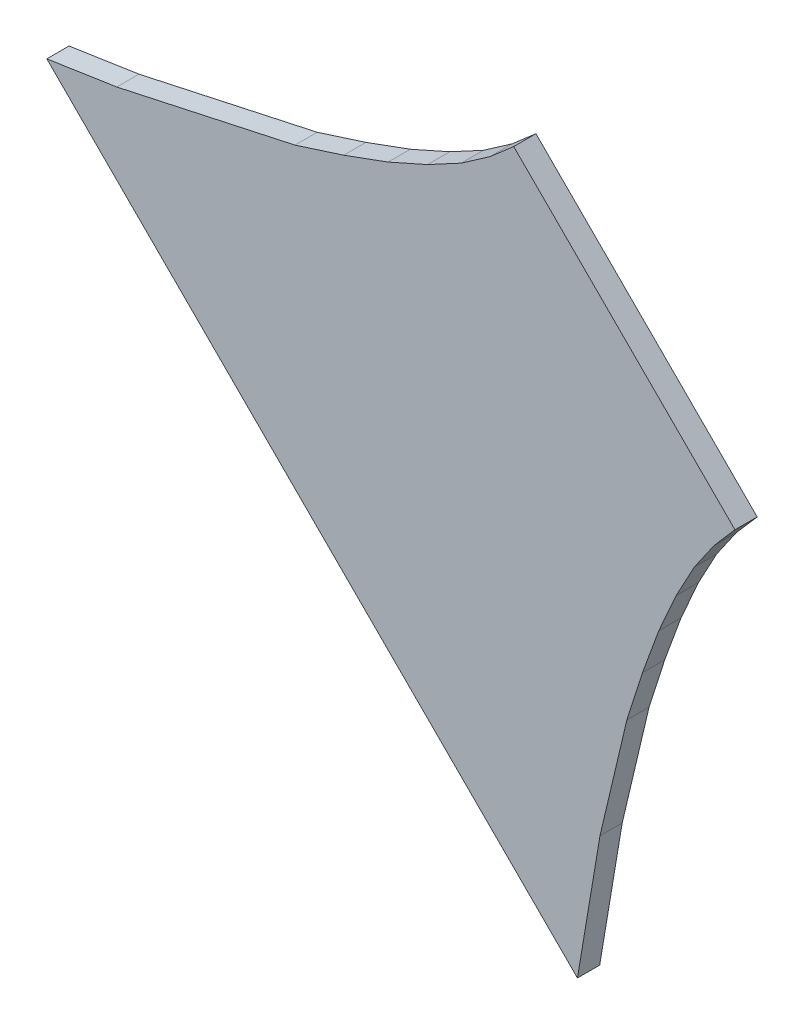
ISO-10303-21;
HEADER;
FILE_DESCRIPTION(('STEP AP214'),'2;1');
FILE_NAME('part.step','',(''),(''),'','','');
FILE_SCHEMA(('AUTOMOTIVE_DESIGN { 1 0 10303 214 1 1 1 1 }'));
ENDSEC;
DATA;
#1=APPLICATION_CONTEXT('core data for automotive mechanical design processes');
#2=APPLICATION_PROTOCOL_DEFINITION('international standard','automotive_design',2000,#1);
#3=PRODUCT_CONTEXT('',#1,'mechanical');
#4=PRODUCT('Part','Part','',(#3));
#5=PRODUCT_RELATED_PRODUCT_CATEGORY('part','',(#4));
#6=PRODUCT_DEFINITION_FORMATION('','',#4);
#7=PRODUCT_DEFINITION_CONTEXT('part definition',#1,'design');
#8=PRODUCT_DEFINITION('design','',#6,#7);
#9=PRODUCT_DEFINITION_SHAPE('','',#8);
#10=(LENGTH_UNIT() NAMED_UNIT(*) SI_UNIT(.MILLI.,.METRE.));
#11=(NAMED_UNIT(*) PLANE_ANGLE_UNIT() SI_UNIT($,.RADIAN.));
#12=(NAMED_UNIT(*) SI_UNIT($,.STERADIAN.) SOLID_ANGLE_UNIT());
#13=UNCERTAINTY_MEASURE_WITH_UNIT(LENGTH_MEASURE(1.E-05),#10,'distance_accuracy_value','');
#14=(GEOMETRIC_REPRESENTATION_CONTEXT(3) GLOBAL_UNCERTAINTY_ASSIGNED_CONTEXT((#13)) GLOBAL_UNIT_ASSIGNED_CONTEXT((#10,
#11,#12)) REPRESENTATION_CONTEXT('',''));
#15=CARTESIAN_POINT('',(0.,0.,0.));
#16=DIRECTION('',(0.,0.,1.));
#17=DIRECTION('',(1.,0.,0.));
#18=AXIS2_PLACEMENT_3D('',#15,#16,#17);
#19=CARTESIAN_POINT('',(91.931999206543,105.322998046875,0.));
#20=DIRECTION('',(0.655634347834404,-0.755078540245818,0.));
#21=DIRECTION('',(-0.755078540245818,-0.655634347834404,0.));
#22=AXIS2_PLACEMENT_3D('',#19,#20,#21);
#23=PLANE('',#22);
#24=DIRECTION('',(-0.755078540245818,-0.655634347834404,0.));
#25=VECTOR('',#24,1.);
#26=CARTESIAN_POINT('',(91.931999206543,105.322998046875,0.03556));
#27=LINE('',#26,#25);
#28=CARTESIAN_POINT('',(91.931999206543,105.322998046875,0.03556));
#29=VERTEX_POINT('',#28);
#30=CARTESIAN_POINT('',(91.8939971923828,105.290000915527,0.03556));
#31=VERTEX_POINT('',#30);
#32=EDGE_CURVE('E11',#29,#31,#27,.T.);
#33=ORIENTED_EDGE('',*,*,#32,.F.);
#34=DIRECTION('',(0.,0.,1.));
#35=VECTOR('',#34,1.);
#36=CARTESIAN_POINT('',(91.931999206543,105.322998046875,0.));
#37=LINE('',#36,#35);
#38=CARTESIAN_POINT('',(91.931999206543,105.322998046875,0.));
#39=VERTEX_POINT('',#38);
#40=EDGE_CURVE('E24',#39,#29,#37,.T.);
#41=ORIENTED_EDGE('',*,*,#40,.F.);
#42=DIRECTION('',(-0.755078540245818,-0.655634347834404,0.));
#43=VECTOR('',#42,1.);
#44=CARTESIAN_POINT('',(91.931999206543,105.322998046875,0.));
#45=LINE('',#44,#43);
#46=CARTESIAN_POINT('',(91.8939971923828,105.290000915527,0.));
#47=VERTEX_POINT('',#46);
#48=EDGE_CURVE('E160',#39,#47,#45,.T.);
#49=ORIENTED_EDGE('',*,*,#48,.T.);
#50=DIRECTION('',(0.,0.,1.));
#51=VECTOR('',#50,1.);
#52=CARTESIAN_POINT('',(91.8939971923828,105.290000915527,0.));
#53=LINE('',#52,#51);
#54=EDGE_CURVE('E37',#47,#31,#53,.T.);
#55=ORIENTED_EDGE('',*,*,#54,.T.);
#56=EDGE_LOOP('',(#33,#41,#49,#55));
#57=FACE_BOUND('',#56,.T.);
#58=ADVANCED_FACE('F17',(#57),#23,.F.);
#59=CARTESIAN_POINT('',(91.8939971923828,105.290000915527,0.));
#60=DIRECTION('',(0.571056509348548,-0.820910752232331,0.));
#61=DIRECTION('',(-0.820910752232331,-0.571056509348548,0.));
#62=AXIS2_PLACEMENT_3D('',#59,#60,#61);
#63=PLANE('',#62);
#64=DIRECTION('',(-0.820910752232331,-0.571056509348548,0.));
#65=VECTOR('',#64,1.);
#66=CARTESIAN_POINT('',(91.8939971923828,105.290000915527,0.03556));
#67=LINE('',#66,#65);
#68=CARTESIAN_POINT('',(91.8479995727539,105.258003234863,0.03556));
#69=VERTEX_POINT('',#68);
#70=EDGE_CURVE('E280',#31,#69,#67,.T.);
#71=ORIENTED_EDGE('',*,*,#70,.F.);
#72=ORIENTED_EDGE('',*,*,#54,.F.);
#73=DIRECTION('',(-0.820910752232331,-0.571056509348548,0.));
#74=VECTOR('',#73,1.);
#75=CARTESIAN_POINT('',(91.8939971923828,105.290000915527,0.));
#76=LINE('',#75,#74);
#77=CARTESIAN_POINT('',(91.8479995727539,105.258003234863,0.));
#78=VERTEX_POINT('',#77);
#79=EDGE_CURVE('E277',#47,#78,#76,.T.);
#80=ORIENTED_EDGE('',*,*,#79,.T.);
#81=DIRECTION('',(0.,0.,1.));
#82=VECTOR('',#81,1.);
#83=CARTESIAN_POINT('',(91.8479995727539,105.258003234863,0.));
#84=LINE('',#83,#82);
#85=EDGE_CURVE('E275',#78,#69,#84,.T.);
#86=ORIENTED_EDGE('',*,*,#85,.T.);
#87=EDGE_LOOP('',(#71,#72,#80,#86));
#88=FACE_BOUND('',#87,.T.);
#89=ADVANCED_FACE('F288',(#88),#63,.F.);
#90=CARTESIAN_POINT('',(91.8479995727539,105.258003234863,0.));
#91=DIRECTION('',(0.473208926679227,-0.880950232255542,0.));
#92=DIRECTION('',(-0.880950232255542,-0.473208926679227,0.));
#93=AXIS2_PLACEMENT_3D('',#90,#91,#92);
#94=PLANE('',#93);
#95=DIRECTION('',(-0.880950232255542,-0.473208926679227,0.));
#96=VECTOR('',#95,1.);
#97=CARTESIAN_POINT('',(91.8479995727539,105.258003234863,0.03556));
#98=LINE('',#97,#96);
#99=CARTESIAN_POINT('',(91.7939987182617,105.228996276855,0.03556));
#100=VERTEX_POINT('',#99);
#101=EDGE_CURVE('E272',#69,#100,#98,.T.);
#102=ORIENTED_EDGE('',*,*,#101,.F.);
#103=ORIENTED_EDGE('',*,*,#85,.F.);
#104=DIRECTION('',(-0.880950232255542,-0.473208926679227,0.));
#105=VECTOR('',#104,1.);
#106=CARTESIAN_POINT('',(91.8479995727539,105.258003234863,0.));
#107=LINE('',#106,#105);
#108=CARTESIAN_POINT('',(91.7939987182617,105.228996276855,0.));
#109=VERTEX_POINT('',#108);
#110=EDGE_CURVE('E269',#78,#109,#107,.T.);
#111=ORIENTED_EDGE('',*,*,#110,.T.);
#112=DIRECTION('',(0.,0.,1.));
#113=VECTOR('',#112,1.);
#114=CARTESIAN_POINT('',(91.7939987182617,105.228996276855,0.));
#115=LINE('',#114,#113);
#116=EDGE_CURVE('E267',#109,#100,#115,.T.);
#117=ORIENTED_EDGE('',*,*,#116,.T.);
#118=EDGE_LOOP('',(#102,#103,#111,#117));
#119=FACE_BOUND('',#118,.T.);
#120=ADVANCED_FACE('F294',(#119),#94,.F.);
#121=CARTESIAN_POINT('',(91.7939987182617,105.228996276855,0.));
#122=DIRECTION('',(0.406159002657106,-0.913802420964502,0.));
#123=DIRECTION('',(-0.913802420964502,-0.406159002657106,0.));
#124=AXIS2_PLACEMENT_3D('',#121,#122,#123);
#125=PLANE('',#124);
#126=DIRECTION('',(-0.913802420964502,-0.406159002657106,0.));
#127=VECTOR('',#126,1.);
#128=CARTESIAN_POINT('',(91.7939987182617,105.228996276855,0.03556));
#129=LINE('',#128,#127);
#130=CARTESIAN_POINT('',(91.7310028076172,105.200996398926,0.03556));
#131=VERTEX_POINT('',#130);
#132=EDGE_CURVE('E264',#100,#131,#129,.T.);
#133=ORIENTED_EDGE('',*,*,#132,.F.);
#134=ORIENTED_EDGE('',*,*,#116,.F.);
#135=DIRECTION('',(-0.913802420964502,-0.406159002657106,0.));
#136=VECTOR('',#135,1.);
#137=CARTESIAN_POINT('',(91.7939987182617,105.228996276855,0.));
#138=LINE('',#137,#136);
#139=CARTESIAN_POINT('',(91.7310028076172,105.200996398926,0.));
#140=VERTEX_POINT('',#139);
#141=EDGE_CURVE('E261',#109,#140,#138,.T.);
#142=ORIENTED_EDGE('',*,*,#141,.T.);
#143=DIRECTION('',(0.,0.,1.));
#144=VECTOR('',#143,1.);
#145=CARTESIAN_POINT('',(91.7310028076172,105.200996398926,0.));
#146=LINE('',#145,#144);
#147=EDGE_CURVE('E259',#140,#131,#146,.T.);
#148=ORIENTED_EDGE('',*,*,#147,.T.);
#149=EDGE_LOOP('',(#133,#134,#142,#148));
#150=FACE_BOUND('',#149,.T.);
#151=ADVANCED_FACE('F296',(#150),#125,.F.);
#152=CARTESIAN_POINT('',(91.7310028076172,105.200996398926,0.));
#153=DIRECTION('',(0.343792073197741,-0.939045797821597,0.));
#154=DIRECTION('',(-0.939045797821597,-0.343792073197741,0.));
#155=AXIS2_PLACEMENT_3D('',#152,#153,#154);
#156=PLANE('',#155);
#157=DIRECTION('',(-0.939045797821597,-0.343792073197741,0.));
#158=VECTOR('',#157,1.);
#159=CARTESIAN_POINT('',(91.7310028076172,105.200996398926,0.03556));
#160=LINE('',#159,#158);
#161=CARTESIAN_POINT('',(91.6600036621094,105.175003051758,0.03556));
#162=VERTEX_POINT('',#161);
#163=EDGE_CURVE('E256',#131,#162,#160,.T.);
#164=ORIENTED_EDGE('',*,*,#163,.F.);
#165=ORIENTED_EDGE('',*,*,#147,.F.);
#166=DIRECTION('',(-0.939045797821597,-0.343792073197741,0.));
#167=VECTOR('',#166,1.);
#168=CARTESIAN_POINT('',(91.7310028076172,105.200996398926,0.));
#169=LINE('',#168,#167);
#170=CARTESIAN_POINT('',(91.6600036621094,105.175003051758,0.));
#171=VERTEX_POINT('',#170);
#172=EDGE_CURVE('E253',#140,#171,#169,.T.);
#173=ORIENTED_EDGE('',*,*,#172,.T.);
#174=DIRECTION('',(0.,0.,1.));
#175=VECTOR('',#174,1.);
#176=CARTESIAN_POINT('',(91.6600036621094,105.175003051758,0.));
#177=LINE('',#176,#175);
#178=EDGE_CURVE('E251',#171,#162,#177,.T.);
#179=ORIENTED_EDGE('',*,*,#178,.T.);
#180=EDGE_LOOP('',(#164,#165,#173,#179));
#181=FACE_BOUND('',#180,.T.);
#182=ADVANCED_FACE('F301',(#181),#156,.F.);
#183=CARTESIAN_POINT('',(91.6600036621094,105.175003051758,0.));
#184=DIRECTION('',(0.305225179343562,-0.952280205556479,0.));
#185=DIRECTION('',(-0.952280205556479,-0.305225179343562,0.));
#186=AXIS2_PLACEMENT_3D('',#183,#184,#185);
#187=PLANE('',#186);
#188=DIRECTION('',(-0.952280205556479,-0.305225179343562,0.));
#189=VECTOR('',#188,1.);
#190=CARTESIAN_POINT('',(91.6600036621094,105.175003051758,0.03556));
#191=LINE('',#190,#189);
#192=CARTESIAN_POINT('',(91.5820007324219,105.150001525879,0.03556));
#193=VERTEX_POINT('',#192);
#194=EDGE_CURVE('E248',#162,#193,#191,.T.);
#195=ORIENTED_EDGE('',*,*,#194,.F.);
#196=ORIENTED_EDGE('',*,*,#178,.F.);
#197=DIRECTION('',(-0.952280205556479,-0.305225179343562,0.));
#198=VECTOR('',#197,1.);
#199=CARTESIAN_POINT('',(91.6600036621094,105.175003051758,0.));
#200=LINE('',#199,#198);
#201=CARTESIAN_POINT('',(91.5820007324219,105.150001525879,0.));
#202=VERTEX_POINT('',#201);
#203=EDGE_CURVE('E245',#171,#202,#200,.T.);
#204=ORIENTED_EDGE('',*,*,#203,.T.);
#205=DIRECTION('',(0.,0.,1.));
#206=VECTOR('',#205,1.);
#207=CARTESIAN_POINT('',(91.5820007324219,105.150001525879,0.));
#208=LINE('',#207,#206);
#209=EDGE_CURVE('E243',#202,#193,#208,.T.);
#210=ORIENTED_EDGE('',*,*,#209,.T.);
#211=EDGE_LOOP('',(#195,#196,#204,#210));
#212=FACE_BOUND('',#211,.T.);
#213=ADVANCED_FACE('F304',(#212),#187,.F.);
#214=CARTESIAN_POINT('',(91.5820007324219,105.150001525879,0.));
#215=DIRECTION('',(0.212582762798648,-0.977143064735607,0.));
#216=DIRECTION('',(-0.977143064735607,-0.212582762798648,0.));
#217=AXIS2_PLACEMENT_3D('',#214,#215,#216);
#218=PLANE('',#217);
#219=DIRECTION('',(-0.977143064735607,-0.212582762798648,0.));
#220=VECTOR('',#219,1.);
#221=CARTESIAN_POINT('',(91.5820007324219,105.150001525879,0.03556));
#222=LINE('',#221,#220);
#223=CARTESIAN_POINT('',(91.2969970703125,105.087997436523,0.03556));
#224=VERTEX_POINT('',#223);
#225=EDGE_CURVE('E240',#193,#224,#222,.T.);
#226=ORIENTED_EDGE('',*,*,#225,.F.);
#227=ORIENTED_EDGE('',*,*,#209,.F.);
#228=DIRECTION('',(-0.977143064735607,-0.212582762798648,0.));
#229=VECTOR('',#228,1.);
#230=CARTESIAN_POINT('',(91.5820007324219,105.150001525879,0.));
#231=LINE('',#230,#229);
#232=CARTESIAN_POINT('',(91.2969970703125,105.087997436523,0.));
#233=VERTEX_POINT('',#232);
#234=EDGE_CURVE('E237',#202,#233,#231,.T.);
#235=ORIENTED_EDGE('',*,*,#234,.T.);
#236=DIRECTION('',(0.,0.,1.));
#237=VECTOR('',#236,1.);
#238=CARTESIAN_POINT('',(91.2969970703125,105.087997436523,0.));
#239=LINE('',#238,#237);
#240=EDGE_CURVE('E235',#233,#224,#239,.T.);
#241=ORIENTED_EDGE('',*,*,#240,.T.);
#242=EDGE_LOOP('',(#226,#227,#235,#241));
#243=FACE_BOUND('',#242,.T.);
#244=ADVANCED_FACE('F309',(#243),#218,.F.);
#245=CARTESIAN_POINT('',(91.2969970703125,105.087997436523,0.));
#246=DIRECTION('',(0.150052763089028,-0.988677990191624,0.));
#247=DIRECTION('',(-0.988677990191624,-0.150052763089028,0.));
#248=AXIS2_PLACEMENT_3D('',#245,#246,#247);
#249=PLANE('',#248);
#250=DIRECTION('',(-0.988677990191624,-0.150052763089028,0.));
#251=VECTOR('',#250,1.);
#252=CARTESIAN_POINT('',(91.2969970703125,105.087997436523,0.03556));
#253=LINE('',#252,#251);
#254=CARTESIAN_POINT('',(91.1849975585938,105.070999145508,0.03556));
#255=VERTEX_POINT('',#254);
#256=EDGE_CURVE('E232',#224,#255,#253,.T.);
#257=ORIENTED_EDGE('',*,*,#256,.F.);
#258=ORIENTED_EDGE('',*,*,#240,.F.);
#259=DIRECTION('',(-0.988677990191624,-0.150052763089028,0.));
#260=VECTOR('',#259,1.);
#261=CARTESIAN_POINT('',(91.2969970703125,105.087997436523,0.));
#262=LINE('',#261,#260);
#263=CARTESIAN_POINT('',(91.1849975585938,105.070999145508,0.));
#264=VERTEX_POINT('',#263);
#265=EDGE_CURVE('E229',#233,#264,#262,.T.);
#266=ORIENTED_EDGE('',*,*,#265,.T.);
#267=DIRECTION('',(0.,0.,1.));
#268=VECTOR('',#267,1.);
#269=CARTESIAN_POINT('',(91.1849975585938,105.070999145508,0.));
#270=LINE('',#269,#268);
#271=EDGE_CURVE('E227',#264,#255,#270,.T.);
#272=ORIENTED_EDGE('',*,*,#271,.T.);
#273=EDGE_LOOP('',(#257,#258,#266,#272));
#274=FACE_BOUND('',#273,.T.);
#275=ADVANCED_FACE('F312',(#274),#249,.F.);
#276=CARTESIAN_POINT('',(91.1849975585938,105.070999145508,0.));
#277=DIRECTION('',(0.707106781186548,0.707106781186548,0.));
#278=DIRECTION('',(0.707106781186548,-0.707106781186548,0.));
#279=AXIS2_PLACEMENT_3D('',#276,#277,#278);
#280=PLANE('',#279);
#281=DIRECTION('',(0.707106781186548,-0.707106781186548,0.));
#282=VECTOR('',#281,1.);
#283=CARTESIAN_POINT('',(91.1849975585938,105.070999145508,0.03556));
#284=LINE('',#283,#282);
#285=CARTESIAN_POINT('',(92.0339965820313,104.22200012207,0.03556));
#286=VERTEX_POINT('',#285);
#287=EDGE_CURVE('E224',#255,#286,#284,.T.);
#288=ORIENTED_EDGE('',*,*,#287,.F.);
#289=ORIENTED_EDGE('',*,*,#271,.F.);
#290=DIRECTION('',(0.707106781186548,-0.707106781186548,0.));
#291=VECTOR('',#290,1.);
#292=CARTESIAN_POINT('',(91.1849975585938,105.070999145508,0.));
#293=LINE('',#292,#291);
#294=CARTESIAN_POINT('',(92.0339965820313,104.22200012207,0.));
#295=VERTEX_POINT('',#294);
#296=EDGE_CURVE('E221',#264,#295,#293,.T.);
#297=ORIENTED_EDGE('',*,*,#296,.T.);
#298=DIRECTION('',(0.,0.,1.));
#299=VECTOR('',#298,1.);
#300=CARTESIAN_POINT('',(92.0339965820313,104.22200012207,0.));
#301=LINE('',#300,#299);
#302=EDGE_CURVE('E219',#295,#286,#301,.T.);
#303=ORIENTED_EDGE('',*,*,#302,.T.);
#304=EDGE_LOOP('',(#288,#289,#297,#303));
#305=FACE_BOUND('',#304,.T.);
#306=ADVANCED_FACE('F317',(#305),#280,.F.);
#307=CARTESIAN_POINT('',(92.0339965820313,104.22200012207,0.));
#308=DIRECTION('',(-0.986266878151509,0.16515945344205,0.));
#309=DIRECTION('',(0.16515945344205,0.986266878151509,0.));
#310=AXIS2_PLACEMENT_3D('',#307,#308,#309);
#311=PLANE('',#310);
#312=DIRECTION('',(0.16515945344205,0.986266878151509,0.));
#313=VECTOR('',#312,1.);
#314=CARTESIAN_POINT('',(92.0339965820313,104.22200012207,0.03556));
#315=LINE('',#314,#313);
#316=CARTESIAN_POINT('',(92.0699996948242,104.436996459961,0.03556));
#317=VERTEX_POINT('',#316);
#318=EDGE_CURVE('E216',#286,#317,#315,.T.);
#319=ORIENTED_EDGE('',*,*,#318,.F.);
#320=ORIENTED_EDGE('',*,*,#302,.F.);
#321=DIRECTION('',(0.16515945344205,0.986266878151509,0.));
#322=VECTOR('',#321,1.);
#323=CARTESIAN_POINT('',(92.0339965820313,104.22200012207,0.));
#324=LINE('',#323,#322);
#325=CARTESIAN_POINT('',(92.0699996948242,104.436996459961,0.));
#326=VERTEX_POINT('',#325);
#327=EDGE_CURVE('E213',#295,#326,#324,.T.);
#328=ORIENTED_EDGE('',*,*,#327,.T.);
#329=DIRECTION('',(0.,0.,1.));
#330=VECTOR('',#329,1.);
#331=CARTESIAN_POINT('',(92.0699996948242,104.436996459961,0.));
#332=LINE('',#331,#330);
#333=EDGE_CURVE('E211',#326,#317,#332,.T.);
#334=ORIENTED_EDGE('',*,*,#333,.T.);
#335=EDGE_LOOP('',(#319,#320,#328,#334));
#336=FACE_BOUND('',#335,.T.);
#337=ADVANCED_FACE('F320',(#336),#311,.F.);
#338=CARTESIAN_POINT('',(92.0699996948242,104.436996459961,0.));
#339=DIRECTION('',(-0.973209181385441,0.22992148500538,0.));
#340=DIRECTION('',(0.22992148500538,0.973209181385441,0.));
#341=AXIS2_PLACEMENT_3D('',#338,#339,#340);
#342=PLANE('',#341);
#343=DIRECTION('',(0.22992148500538,0.973209181385441,0.));
#344=VECTOR('',#343,1.);
#345=CARTESIAN_POINT('',(92.0699996948242,104.436996459961,0.03556));
#346=LINE('',#345,#344);
#347=CARTESIAN_POINT('',(92.1129989624023,104.619003295898,0.03556));
#348=VERTEX_POINT('',#347);
#349=EDGE_CURVE('E208',#317,#348,#346,.T.);
#350=ORIENTED_EDGE('',*,*,#349,.F.);
#351=ORIENTED_EDGE('',*,*,#333,.F.);
#352=DIRECTION('',(0.22992148500538,0.973209181385441,0.));
#353=VECTOR('',#352,1.);
#354=CARTESIAN_POINT('',(92.0699996948242,104.436996459961,0.));
#355=LINE('',#354,#353);
#356=CARTESIAN_POINT('',(92.1129989624023,104.619003295898,0.));
#357=VERTEX_POINT('',#356);
#358=EDGE_CURVE('E205',#326,#357,#355,.T.);
#359=ORIENTED_EDGE('',*,*,#358,.T.);
#360=DIRECTION('',(0.,0.,1.));
#361=VECTOR('',#360,1.);
#362=CARTESIAN_POINT('',(92.1129989624023,104.619003295898,0.));
#363=LINE('',#362,#361);
#364=EDGE_CURVE('E203',#357,#348,#363,.T.);
#365=ORIENTED_EDGE('',*,*,#364,.T.);
#366=EDGE_LOOP('',(#350,#351,#359,#365));
#367=FACE_BOUND('',#366,.T.);
#368=ADVANCED_FACE('F325',(#367),#342,.F.);
#369=CARTESIAN_POINT('',(92.1129989624023,104.619003295898,0.));
#370=DIRECTION('',(-0.952271527101495,0.305252254163318,0.));
#371=DIRECTION('',(0.305252254163318,0.952271527101495,0.));
#372=AXIS2_PLACEMENT_3D('',#369,#370,#371);
#373=PLANE('',#372);
#374=DIRECTION('',(0.305252254163318,0.952271527101495,0.));
#375=VECTOR('',#374,1.);
#376=CARTESIAN_POINT('',(92.1129989624023,104.619003295898,0.03556));
#377=LINE('',#376,#375);
#378=CARTESIAN_POINT('',(92.1380004882812,104.696998596191,0.03556));
#379=VERTEX_POINT('',#378);
#380=EDGE_CURVE('E200',#348,#379,#377,.T.);
#381=ORIENTED_EDGE('',*,*,#380,.F.);
#382=ORIENTED_EDGE('',*,*,#364,.F.);
#383=DIRECTION('',(0.305252254163318,0.952271527101495,0.));
#384=VECTOR('',#383,1.);
#385=CARTESIAN_POINT('',(92.1129989624023,104.619003295898,0.));
#386=LINE('',#385,#384);
#387=CARTESIAN_POINT('',(92.1380004882812,104.696998596191,0.));
#388=VERTEX_POINT('',#387);
#389=EDGE_CURVE('E197',#357,#388,#386,.T.);
#390=ORIENTED_EDGE('',*,*,#389,.T.);
#391=DIRECTION('',(0.,0.,1.));
#392=VECTOR('',#391,1.);
#393=CARTESIAN_POINT('',(92.1380004882812,104.696998596191,0.));
#394=LINE('',#393,#392);
#395=EDGE_CURVE('E195',#388,#379,#394,.T.);
#396=ORIENTED_EDGE('',*,*,#395,.T.);
#397=EDGE_LOOP('',(#381,#382,#390,#396));
#398=FACE_BOUND('',#397,.T.);
#399=ADVANCED_FACE('F328',(#398),#373,.F.);
#400=CARTESIAN_POINT('',(92.1380004882812,104.696998596191,0.));
#401=DIRECTION('',(-0.939013218091138,0.343881049565291,0.));
#402=DIRECTION('',(0.343881049565291,0.939013218091138,0.));
#403=AXIS2_PLACEMENT_3D('',#400,#401,#402);
#404=PLANE('',#403);
#405=DIRECTION('',(0.343881049565291,0.939013218091137,0.));
#406=VECTOR('',#405,1.);
#407=CARTESIAN_POINT('',(92.1380004882812,104.696998596191,0.03556));
#408=LINE('',#407,#406);
#409=CARTESIAN_POINT('',(92.1640014648438,104.767997741699,0.03556));
#410=VERTEX_POINT('',#409);
#411=EDGE_CURVE('E192',#379,#410,#408,.T.);
#412=ORIENTED_EDGE('',*,*,#411,.F.);
#413=ORIENTED_EDGE('',*,*,#395,.F.);
#414=DIRECTION('',(0.343881049565291,0.939013218091137,0.));
#415=VECTOR('',#414,1.);
#416=CARTESIAN_POINT('',(92.1380004882812,104.696998596191,0.));
#417=LINE('',#416,#415);
#418=CARTESIAN_POINT('',(92.1640014648438,104.767997741699,0.));
#419=VERTEX_POINT('',#418);
#420=EDGE_CURVE('E189',#388,#419,#417,.T.);
#421=ORIENTED_EDGE('',*,*,#420,.T.);
#422=DIRECTION('',(0.,0.,1.));
#423=VECTOR('',#422,1.);
#424=CARTESIAN_POINT('',(92.1640014648438,104.767997741699,0.));
#425=LINE('',#424,#423);
#426=EDGE_CURVE('E187',#419,#410,#425,.T.);
#427=ORIENTED_EDGE('',*,*,#426,.T.);
#428=EDGE_LOOP('',(#412,#413,#421,#427));
#429=FACE_BOUND('',#428,.T.);
#430=ADVANCED_FACE('F333',(#429),#404,.F.);
#431=CARTESIAN_POINT('',(92.1640014648438,104.767997741699,0.));
#432=DIRECTION('',(-0.913820674891546,0.406117931321382,0.));
#433=DIRECTION('',(0.406117931321382,0.913820674891546,0.));
#434=AXIS2_PLACEMENT_3D('',#431,#432,#433);
#435=PLANE('',#434);
#436=DIRECTION('',(0.406117931321382,0.913820674891546,0.));
#437=VECTOR('',#436,1.);
#438=CARTESIAN_POINT('',(92.1640014648438,104.767997741699,0.03556));
#439=LINE('',#438,#437);
#440=CARTESIAN_POINT('',(92.1920013427734,104.831001281738,0.03556));
#441=VERTEX_POINT('',#440);
#442=EDGE_CURVE('E184',#410,#441,#439,.T.);
#443=ORIENTED_EDGE('',*,*,#442,.F.);
#444=ORIENTED_EDGE('',*,*,#426,.F.);
#445=DIRECTION('',(0.406117931321382,0.913820674891546,0.));
#446=VECTOR('',#445,1.);
#447=CARTESIAN_POINT('',(92.1640014648438,104.767997741699,0.));
#448=LINE('',#447,#446);
#449=CARTESIAN_POINT('',(92.1920013427734,104.831001281738,0.));
#450=VERTEX_POINT('',#449);
#451=EDGE_CURVE('E181',#419,#450,#448,.T.);
#452=ORIENTED_EDGE('',*,*,#451,.T.);
#453=DIRECTION('',(0.,0.,1.));
#454=VECTOR('',#453,1.);
#455=CARTESIAN_POINT('',(92.1920013427734,104.831001281738,0.));
#456=LINE('',#455,#454);
#457=EDGE_CURVE('E179',#450,#441,#456,.T.);
#458=ORIENTED_EDGE('',*,*,#457,.T.);
#459=EDGE_LOOP('',(#443,#444,#452,#458));
#460=FACE_BOUND('',#459,.T.);
#461=ADVANCED_FACE('F336',(#460),#435,.F.);
#462=CARTESIAN_POINT('',(92.1920013427734,104.831001281738,0.));
#463=DIRECTION('',(-0.881002115409217,0.473112325610403,0.));
#464=DIRECTION('',(0.473112325610403,0.881002115409217,0.));
#465=AXIS2_PLACEMENT_3D('',#462,#463,#464);
#466=PLANE('',#465);
#467=DIRECTION('',(0.473112325610403,0.881002115409217,0.));
#468=VECTOR('',#467,1.);
#469=CARTESIAN_POINT('',(92.1920013427734,104.831001281738,0.03556));
#470=LINE('',#469,#468);
#471=CARTESIAN_POINT('',(92.2210006713867,104.88500213623,0.03556));
#472=VERTEX_POINT('',#471);
#473=EDGE_CURVE('E176',#441,#472,#470,.T.);
#474=ORIENTED_EDGE('',*,*,#473,.F.);
#475=ORIENTED_EDGE('',*,*,#457,.F.);
#476=DIRECTION('',(0.473112325610403,0.881002115409217,0.));
#477=VECTOR('',#476,1.);
#478=CARTESIAN_POINT('',(92.1920013427734,104.831001281738,0.));
#479=LINE('',#478,#477);
#480=CARTESIAN_POINT('',(92.2210006713867,104.88500213623,0.));
#481=VERTEX_POINT('',#480);
#482=EDGE_CURVE('E173',#450,#481,#479,.T.);
#483=ORIENTED_EDGE('',*,*,#482,.T.);
#484=DIRECTION('',(0.,0.,1.));
#485=VECTOR('',#484,1.);
#486=CARTESIAN_POINT('',(92.2210006713867,104.88500213623,0.));
#487=LINE('',#486,#485);
#488=EDGE_CURVE('E171',#481,#472,#487,.T.);
#489=ORIENTED_EDGE('',*,*,#488,.T.);
#490=EDGE_LOOP('',(#474,#475,#483,#489));
#491=FACE_BOUND('',#490,.T.);
#492=ADVANCED_FACE('F341',(#491),#466,.F.);
#493=CARTESIAN_POINT('',(92.2210006713867,104.88500213623,0.));
#494=DIRECTION('',(-0.820910752232331,0.571056509348548,0.));
#495=DIRECTION('',(0.571056509348548,0.820910752232331,0.));
#496=AXIS2_PLACEMENT_3D('',#493,#494,#495);
#497=PLANE('',#496);
#498=DIRECTION('',(0.571056509348548,0.820910752232331,0.));
#499=VECTOR('',#498,1.);
#500=CARTESIAN_POINT('',(92.2210006713867,104.88500213623,0.03556));
#501=LINE('',#500,#499);
#502=CARTESIAN_POINT('',(92.2529983520508,104.930999755859,0.03556));
#503=VERTEX_POINT('',#502);
#504=EDGE_CURVE('E168',#472,#503,#501,.T.);
#505=ORIENTED_EDGE('',*,*,#504,.F.);
#506=ORIENTED_EDGE('',*,*,#488,.F.);
#507=DIRECTION('',(0.571056509348548,0.820910752232331,0.));
#508=VECTOR('',#507,1.);
#509=CARTESIAN_POINT('',(92.2210006713867,104.88500213623,0.));
#510=LINE('',#509,#508);
#511=CARTESIAN_POINT('',(92.2529983520508,104.930999755859,0.));
#512=VERTEX_POINT('',#511);
#513=EDGE_CURVE('E166',#481,#512,#510,.T.);
#514=ORIENTED_EDGE('',*,*,#513,.T.);
#515=DIRECTION('',(0.,0.,1.));
#516=VECTOR('',#515,1.);
#517=CARTESIAN_POINT('',(92.2529983520508,104.930999755859,0.));
#518=LINE('',#517,#516);
#519=EDGE_CURVE('E151',#512,#503,#518,.T.);
#520=ORIENTED_EDGE('',*,*,#519,.T.);
#521=EDGE_LOOP('',(#505,#506,#514,#520));
#522=FACE_BOUND('',#521,.T.);
#523=ADVANCED_FACE('F343',(#522),#497,.F.);
#524=CARTESIAN_POINT('',(92.2529983520508,104.930999755859,0.));
#525=DIRECTION('',(-0.75500349643707,0.655720764020631,0.));
#526=DIRECTION('',(0.655720764020631,0.75500349643707,0.));
#527=AXIS2_PLACEMENT_3D('',#524,#525,#526);
#528=PLANE('',#527);
#529=DIRECTION('',(0.655720764020631,0.75500349643707,0.));
#530=VECTOR('',#529,1.);
#531=CARTESIAN_POINT('',(92.2529983520508,104.930999755859,0.03556));
#532=LINE('',#531,#530);
#533=CARTESIAN_POINT('',(92.286003112793,104.96900177002,0.03556));
#534=VERTEX_POINT('',#533);
#535=EDGE_CURVE('E155',#503,#534,#532,.T.);
#536=ORIENTED_EDGE('',*,*,#535,.F.);
#537=ORIENTED_EDGE('',*,*,#519,.F.);
#538=DIRECTION('',(0.655720764020631,0.75500349643707,0.));
#539=VECTOR('',#538,1.);
#540=CARTESIAN_POINT('',(92.2529983520508,104.930999755859,0.));
#541=LINE('',#540,#539);
#542=CARTESIAN_POINT('',(92.286003112793,104.96900177002,0.));
#543=VERTEX_POINT('',#542);
#544=EDGE_CURVE('E147',#512,#543,#541,.T.);
#545=ORIENTED_EDGE('',*,*,#544,.T.);
#546=DIRECTION('',(0.,0.,1.));
#547=VECTOR('',#546,1.);
#548=CARTESIAN_POINT('',(92.286003112793,104.96900177002,0.));
#549=LINE('',#548,#547);
#550=EDGE_CURVE('E137',#543,#534,#549,.T.);
#551=ORIENTED_EDGE('',*,*,#550,.T.);
#552=EDGE_LOOP('',(#536,#537,#545,#551));
#553=FACE_BOUND('',#552,.T.);
#554=ADVANCED_FACE('F150',(#553),#528,.F.);
#555=CARTESIAN_POINT('',(92.286003112793,104.96900177002,0.));
#556=DIRECTION('',(-0.707099161378241,-0.707114400912744,0.));
#557=DIRECTION('',(-0.707114400912744,0.707099161378241,0.));
#558=AXIS2_PLACEMENT_3D('',#555,#556,#557);
#559=PLANE('',#558);
#560=DIRECTION('',(-0.707114400912744,0.707099161378241,0.));
#561=VECTOR('',#560,1.);
#562=CARTESIAN_POINT('',(92.286003112793,104.96900177002,0.03556));
#563=LINE('',#562,#561);
#564=EDGE_CURVE('E143',#534,#29,#563,.T.);
#565=ORIENTED_EDGE('',*,*,#564,.F.);
#566=ORIENTED_EDGE('',*,*,#550,.F.);
#567=DIRECTION('',(-0.707114400912744,0.707099161378241,0.));
#568=VECTOR('',#567,1.);
#569=CARTESIAN_POINT('',(92.286003112793,104.96900177002,0.));
#570=LINE('',#569,#568);
#571=EDGE_CURVE('E141',#543,#39,#570,.T.);
#572=ORIENTED_EDGE('',*,*,#571,.T.);
#573=ORIENTED_EDGE('',*,*,#40,.T.);
#574=EDGE_LOOP('',(#565,#566,#572,#573));
#575=FACE_BOUND('',#574,.T.);
#576=ADVANCED_FACE('F139',(#575),#559,.F.);
#577=CARTESIAN_POINT('',(91.931999206543,105.322998046875,0.));
#578=DIRECTION('',(0.,0.,1.));
#579=DIRECTION('',(1.,0.,0.));
#580=AXIS2_PLACEMENT_3D('',#577,#578,#579);
#581=PLANE('',#580);
#582=ORIENTED_EDGE('',*,*,#571,.F.);
#583=ORIENTED_EDGE('',*,*,#544,.F.);
#584=ORIENTED_EDGE('',*,*,#513,.F.);
#585=ORIENTED_EDGE('',*,*,#482,.F.);
#586=ORIENTED_EDGE('',*,*,#451,.F.);
#587=ORIENTED_EDGE('',*,*,#420,.F.);
#588=ORIENTED_EDGE('',*,*,#389,.F.);
#589=ORIENTED_EDGE('',*,*,#358,.F.);
#590=ORIENTED_EDGE('',*,*,#327,.F.);
#591=ORIENTED_EDGE('',*,*,#296,.F.);
#592=ORIENTED_EDGE('',*,*,#265,.F.);
#593=ORIENTED_EDGE('',*,*,#234,.F.);
#594=ORIENTED_EDGE('',*,*,#203,.F.);
#595=ORIENTED_EDGE('',*,*,#172,.F.);
#596=ORIENTED_EDGE('',*,*,#141,.F.);
#597=ORIENTED_EDGE('',*,*,#110,.F.);
#598=ORIENTED_EDGE('',*,*,#79,.F.);
#599=ORIENTED_EDGE('',*,*,#48,.F.);
#600=EDGE_LOOP('',(#582,#583,#584,#585,#586,#587,#588,#589,#590,#591,#592,#593,#594,#595,#596,
#597,#598,#599));
#601=FACE_BOUND('',#600,.T.);
#602=ADVANCED_FACE('F158',(#601),#581,.F.);
#603=CARTESIAN_POINT('',(91.931999206543,105.322998046875,0.03556));
#604=DIRECTION('',(0.,0.,1.));
#605=DIRECTION('',(1.,0.,0.));
#606=AXIS2_PLACEMENT_3D('',#603,#604,#605);
#607=PLANE('',#606);
#608=ORIENTED_EDGE('',*,*,#32,.T.);
#609=ORIENTED_EDGE('',*,*,#70,.T.);
#610=ORIENTED_EDGE('',*,*,#101,.T.);
#611=ORIENTED_EDGE('',*,*,#132,.T.);
#612=ORIENTED_EDGE('',*,*,#163,.T.);
#613=ORIENTED_EDGE('',*,*,#194,.T.);
#614=ORIENTED_EDGE('',*,*,#225,.T.);
#615=ORIENTED_EDGE('',*,*,#256,.T.);
#616=ORIENTED_EDGE('',*,*,#287,.T.);
#617=ORIENTED_EDGE('',*,*,#318,.T.);
#618=ORIENTED_EDGE('',*,*,#349,.T.);
#619=ORIENTED_EDGE('',*,*,#380,.T.);
#620=ORIENTED_EDGE('',*,*,#411,.T.);
#621=ORIENTED_EDGE('',*,*,#442,.T.);
#622=ORIENTED_EDGE('',*,*,#473,.T.);
#623=ORIENTED_EDGE('',*,*,#504,.T.);
#624=ORIENTED_EDGE('',*,*,#535,.T.);
#625=ORIENTED_EDGE('',*,*,#564,.T.);
#626=EDGE_LOOP('',(#608,#609,#610,#611,#612,#613,#614,#615,#616,#617,#618,#619,#620,#621,#622,
#623,#624,#625));
#627=FACE_BOUND('',#626,.T.);
#628=ADVANCED_FACE('F291',(#627),#607,.T.);
#629=CLOSED_SHELL('',(#58,#89,#120,#151,#182,#213,#244,#275,#306,#337,#368,#399,#430,#461,#492,
#523,#554,#576,#602,#628));
#630=MANIFOLD_SOLID_BREP('B1',#629);
#631=ADVANCED_BREP_SHAPE_REPRESENTATION('',(#18,#630),#14);
#632=SHAPE_DEFINITION_REPRESENTATION(#9,#631);
ENDSEC;
END-ISO-10303-21;
